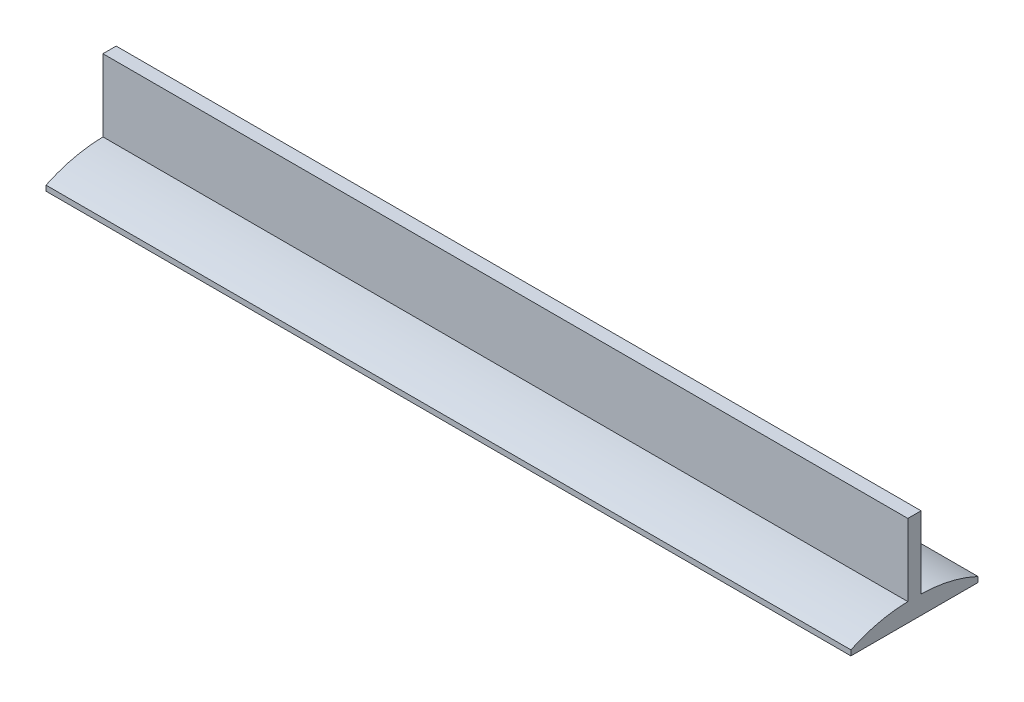
ISO-10303-21;
HEADER;
FILE_DESCRIPTION(('STEP AP214'),'2;1');
FILE_NAME('part.step','',(''),(''),'','','');
FILE_SCHEMA(('AUTOMOTIVE_DESIGN { 1 0 10303 214 1 1 1 1 }'));
ENDSEC;
DATA;
#1=APPLICATION_CONTEXT('core data for automotive mechanical design processes');
#2=APPLICATION_PROTOCOL_DEFINITION('international standard','automotive_design',2000,#1);
#3=PRODUCT_CONTEXT('',#1,'mechanical');
#4=PRODUCT('Part','Part','',(#3));
#5=PRODUCT_RELATED_PRODUCT_CATEGORY('part','',(#4));
#6=PRODUCT_DEFINITION_FORMATION('','',#4);
#7=PRODUCT_DEFINITION_CONTEXT('part definition',#1,'design');
#8=PRODUCT_DEFINITION('design','',#6,#7);
#9=PRODUCT_DEFINITION_SHAPE('','',#8);
#10=(LENGTH_UNIT() NAMED_UNIT(*) SI_UNIT(.MILLI.,.METRE.));
#11=(NAMED_UNIT(*) PLANE_ANGLE_UNIT() SI_UNIT($,.RADIAN.));
#12=(NAMED_UNIT(*) SI_UNIT($,.STERADIAN.) SOLID_ANGLE_UNIT());
#13=UNCERTAINTY_MEASURE_WITH_UNIT(LENGTH_MEASURE(1.E-05),#10,'distance_accuracy_value','');
#14=(GEOMETRIC_REPRESENTATION_CONTEXT(3) GLOBAL_UNCERTAINTY_ASSIGNED_CONTEXT((#13)) GLOBAL_UNIT_ASSIGNED_CONTEXT((#10,
#11,#12)) REPRESENTATION_CONTEXT('',''));
#15=CARTESIAN_POINT('',(0.,0.,0.));
#16=DIRECTION('',(0.,0.,1.));
#17=DIRECTION('',(1.,0.,0.));
#18=AXIS2_PLACEMENT_3D('',#15,#16,#17);
#19=CARTESIAN_POINT('',(-482.6,0.,0.));
#20=DIRECTION('',(0.,-1.,0.));
#21=DIRECTION('',(0.,0.,-1.));
#22=AXIS2_PLACEMENT_3D('',#19,#20,#21);
#23=PLANE('',#22);
#24=DIRECTION('',(0.,0.,-1.));
#25=VECTOR('',#24,1.);
#26=CARTESIAN_POINT('',(0.,0.,0.));
#27=LINE('',#26,#25);
#28=CARTESIAN_POINT('',(0.,0.,38.1));
#29=VERTEX_POINT('',#28);
#30=CARTESIAN_POINT('',(0.,0.,-38.1));
#31=VERTEX_POINT('',#30);
#32=EDGE_CURVE('E143',#29,#31,#27,.T.);
#33=ORIENTED_EDGE('',*,*,#32,.F.);
#34=DIRECTION('',(1.,0.,0.));
#35=VECTOR('',#34,1.);
#36=CARTESIAN_POINT('',(-482.6,0.,38.1));
#37=LINE('',#36,#35);
#38=CARTESIAN_POINT('',(-482.6,0.,38.1));
#39=VERTEX_POINT('',#38);
#40=EDGE_CURVE('E147',#39,#29,#37,.T.);
#41=ORIENTED_EDGE('',*,*,#40,.F.);
#42=DIRECTION('',(0.,0.,-1.));
#43=VECTOR('',#42,1.);
#44=CARTESIAN_POINT('',(-482.6,0.,0.));
#45=LINE('',#44,#43);
#46=CARTESIAN_POINT('',(-482.6,0.,-38.1));
#47=VERTEX_POINT('',#46);
#48=EDGE_CURVE('E134',#39,#47,#45,.T.);
#49=ORIENTED_EDGE('',*,*,#48,.T.);
#50=DIRECTION('',(1.,0.,0.));
#51=VECTOR('',#50,1.);
#52=CARTESIAN_POINT('',(-482.6,0.,-38.1));
#53=LINE('',#52,#51);
#54=EDGE_CURVE('E38',#47,#31,#53,.T.);
#55=ORIENTED_EDGE('',*,*,#54,.T.);
#56=EDGE_LOOP('',(#33,#41,#49,#55));
#57=FACE_BOUND('',#56,.T.);
#58=ADVANCED_FACE('F35',(#57),#23,.T.);
#59=CARTESIAN_POINT('',(-482.6,54.3464875628072,0.));
#60=DIRECTION('',(0.,1.,0.));
#61=DIRECTION('',(0.,0.,1.));
#62=AXIS2_PLACEMENT_3D('',#59,#60,#61);
#63=PLANE('',#62);
#64=DIRECTION('',(0.,0.,1.));
#65=VECTOR('',#64,1.);
#66=CARTESIAN_POINT('',(0.,54.3464875628072,0.));
#67=LINE('',#66,#65);
#68=CARTESIAN_POINT('',(0.,54.3464875628072,-3.96875000000001));
#69=VERTEX_POINT('',#68);
#70=CARTESIAN_POINT('',(0.,54.3464875628072,3.96875000000001));
#71=VERTEX_POINT('',#70);
#72=EDGE_CURVE('E138',#69,#71,#67,.T.);
#73=ORIENTED_EDGE('',*,*,#72,.F.);
#74=DIRECTION('',(1.,0.,0.));
#75=VECTOR('',#74,1.);
#76=CARTESIAN_POINT('',(-482.6,54.3464875628072,-3.96875000000001));
#77=LINE('',#76,#75);
#78=CARTESIAN_POINT('',(-482.6,54.3464875628072,-3.96875000000001));
#79=VERTEX_POINT('',#78);
#80=EDGE_CURVE('E11',#79,#69,#77,.T.);
#81=ORIENTED_EDGE('',*,*,#80,.F.);
#82=DIRECTION('',(0.,0.,1.));
#83=VECTOR('',#82,1.);
#84=CARTESIAN_POINT('',(-482.6,54.3464875628072,0.));
#85=LINE('',#84,#83);
#86=CARTESIAN_POINT('',(-482.6,54.3464875628072,3.96875000000001));
#87=VERTEX_POINT('',#86);
#88=EDGE_CURVE('E103',#79,#87,#85,.T.);
#89=ORIENTED_EDGE('',*,*,#88,.T.);
#90=DIRECTION('',(1.,0.,0.));
#91=VECTOR('',#90,1.);
#92=CARTESIAN_POINT('',(-482.6,54.3464875628072,3.96875000000001));
#93=LINE('',#92,#91);
#94=EDGE_CURVE('E107',#87,#71,#93,.T.);
#95=ORIENTED_EDGE('',*,*,#94,.T.);
#96=EDGE_LOOP('',(#73,#81,#89,#95));
#97=FACE_BOUND('',#96,.T.);
#98=ADVANCED_FACE('F105',(#97),#63,.T.);
#99=CARTESIAN_POINT('',(-482.6,54.3464875628072,-3.96875000000001));
#100=DIRECTION('',(0.,0.,-1.));
#101=DIRECTION('',(0.,1.,0.));
#102=AXIS2_PLACEMENT_3D('',#99,#100,#101);
#103=PLANE('',#102);
#104=DIRECTION('',(0.,1.,0.));
#105=VECTOR('',#104,1.);
#106=CARTESIAN_POINT('',(0.,54.3464875628072,-3.96875000000001));
#107=LINE('',#106,#105);
#108=CARTESIAN_POINT('',(0.,11.1514530705264,-3.96875000000001));
#109=VERTEX_POINT('',#108);
#110=EDGE_CURVE('E153',#109,#69,#107,.T.);
#111=ORIENTED_EDGE('',*,*,#110,.F.);
#112=DIRECTION('',(1.,0.,0.));
#113=VECTOR('',#112,1.);
#114=CARTESIAN_POINT('',(-482.6,11.1514530705264,-3.96875000000001));
#115=LINE('',#114,#113);
#116=CARTESIAN_POINT('',(-482.6,11.1514530705264,-3.96875000000001));
#117=VERTEX_POINT('',#116);
#118=EDGE_CURVE('E44',#117,#109,#115,.T.);
#119=ORIENTED_EDGE('',*,*,#118,.F.);
#120=DIRECTION('',(0.,1.,0.));
#121=VECTOR('',#120,1.);
#122=CARTESIAN_POINT('',(-482.6,54.3464875628072,-3.96875000000001));
#123=LINE('',#122,#121);
#124=EDGE_CURVE('E110',#117,#79,#123,.T.);
#125=ORIENTED_EDGE('',*,*,#124,.T.);
#126=ORIENTED_EDGE('',*,*,#80,.T.);
#127=EDGE_LOOP('',(#111,#119,#125,#126));
#128=FACE_BOUND('',#127,.T.);
#129=ADVANCED_FACE('F179',(#128),#103,.T.);
#130=CARTESIAN_POINT('',(-482.6,-72.6535124371928,-2.38125000000002));
#131=DIRECTION('',(1.,0.,0.));
#132=DIRECTION('',(0.,0.,-1.));
#133=AXIS2_PLACEMENT_3D('',#130,#131,#132);
#134=CYLINDRICAL_SURFACE('',#133,83.82);
#135=CARTESIAN_POINT('',(0.,-72.6535124371928,-2.38125000000002));
#136=DIRECTION('',(1.,0.,0.));
#137=DIRECTION('',(0.,0.,1.));
#138=AXIS2_PLACEMENT_3D('',#135,#136,#137);
#139=CIRCLE('',#138,83.82);
#140=CARTESIAN_POINT('',(0.,3.175,-38.1));
#141=VERTEX_POINT('',#140);
#142=EDGE_CURVE('E150',#141,#109,#139,.T.);
#143=ORIENTED_EDGE('',*,*,#142,.F.);
#144=DIRECTION('',(1.,0.,0.));
#145=VECTOR('',#144,1.);
#146=CARTESIAN_POINT('',(-482.6,3.175,-38.1));
#147=LINE('',#146,#145);
#148=CARTESIAN_POINT('',(-482.6,3.175,-38.1));
#149=VERTEX_POINT('',#148);
#150=EDGE_CURVE('E157',#149,#141,#147,.T.);
#151=ORIENTED_EDGE('',*,*,#150,.F.);
#152=CARTESIAN_POINT('',(-482.6,-72.6535124371928,-2.38125000000002));
#153=DIRECTION('',(1.,0.,0.));
#154=DIRECTION('',(0.,0.,1.));
#155=AXIS2_PLACEMENT_3D('',#152,#153,#154);
#156=CIRCLE('',#155,83.82);
#157=EDGE_CURVE('E140',#149,#117,#156,.T.);
#158=ORIENTED_EDGE('',*,*,#157,.T.);
#159=ORIENTED_EDGE('',*,*,#118,.T.);
#160=EDGE_LOOP('',(#143,#151,#158,#159));
#161=FACE_BOUND('',#160,.T.);
#162=ADVANCED_FACE('F181',(#161),#134,.T.);
#163=CARTESIAN_POINT('',(-482.6,0.,-38.1));
#164=DIRECTION('',(0.,0.,-1.));
#165=DIRECTION('',(-1.,0.,0.));
#166=AXIS2_PLACEMENT_3D('',#163,#164,#165);
#167=PLANE('',#166);
#168=DIRECTION('',(0.,1.,0.));
#169=VECTOR('',#168,1.);
#170=CARTESIAN_POINT('',(0.,0.,-38.1));
#171=LINE('',#170,#169);
#172=EDGE_CURVE('E146',#31,#141,#171,.T.);
#173=ORIENTED_EDGE('',*,*,#172,.F.);
#174=ORIENTED_EDGE('',*,*,#54,.F.);
#175=DIRECTION('',(0.,1.,0.));
#176=VECTOR('',#175,1.);
#177=CARTESIAN_POINT('',(-482.6,0.,-38.1));
#178=LINE('',#177,#176);
#179=EDGE_CURVE('E137',#47,#149,#178,.T.);
#180=ORIENTED_EDGE('',*,*,#179,.T.);
#181=ORIENTED_EDGE('',*,*,#150,.T.);
#182=EDGE_LOOP('',(#173,#174,#180,#181));
#183=FACE_BOUND('',#182,.T.);
#184=ADVANCED_FACE('F161',(#183),#167,.T.);
#185=CARTESIAN_POINT('',(-482.6,-72.6535124371928,-2.38125000000002));
#186=DIRECTION('',(-1.,0.,0.));
#187=DIRECTION('',(0.,0.,1.));
#188=AXIS2_PLACEMENT_3D('',#185,#186,#187);
#189=PLANE('',#188);
#190=ORIENTED_EDGE('',*,*,#48,.F.);
#191=DIRECTION('',(0.,1.,0.));
#192=VECTOR('',#191,1.);
#193=CARTESIAN_POINT('',(-482.6,0.,38.1));
#194=LINE('',#193,#192);
#195=CARTESIAN_POINT('',(-482.6,3.175,38.1));
#196=VERTEX_POINT('',#195);
#197=EDGE_CURVE('E127',#39,#196,#194,.T.);
#198=ORIENTED_EDGE('',*,*,#197,.T.);
#199=CARTESIAN_POINT('',(-482.6,-72.6535124371928,2.38125000000002));
#200=DIRECTION('',(-1.,0.,0.));
#201=DIRECTION('',(0.,0.,-1.));
#202=AXIS2_PLACEMENT_3D('',#199,#200,#201);
#203=CIRCLE('',#202,83.82);
#204=CARTESIAN_POINT('',(-482.6,11.1514530705264,3.96875000000001));
#205=VERTEX_POINT('',#204);
#206=EDGE_CURVE('E116',#196,#205,#203,.T.);
#207=ORIENTED_EDGE('',*,*,#206,.T.);
#208=DIRECTION('',(0.,1.,0.));
#209=VECTOR('',#208,1.);
#210=CARTESIAN_POINT('',(-482.6,54.3464875628072,3.96875000000001));
#211=LINE('',#210,#209);
#212=EDGE_CURVE('E113',#205,#87,#211,.T.);
#213=ORIENTED_EDGE('',*,*,#212,.T.);
#214=ORIENTED_EDGE('',*,*,#88,.F.);
#215=ORIENTED_EDGE('',*,*,#124,.F.);
#216=ORIENTED_EDGE('',*,*,#157,.F.);
#217=ORIENTED_EDGE('',*,*,#179,.F.);
#218=EDGE_LOOP('',(#190,#198,#207,#213,#214,#215,#216,#217));
#219=FACE_BOUND('',#218,.T.);
#220=ADVANCED_FACE('F114',(#219),#189,.T.);
#221=CARTESIAN_POINT('',(0.,-72.6535124371928,-2.38125000000002));
#222=DIRECTION('',(-1.,0.,0.));
#223=DIRECTION('',(0.,0.,1.));
#224=AXIS2_PLACEMENT_3D('',#221,#222,#223);
#225=PLANE('',#224);
#226=ORIENTED_EDGE('',*,*,#32,.T.);
#227=ORIENTED_EDGE('',*,*,#172,.T.);
#228=ORIENTED_EDGE('',*,*,#142,.T.);
#229=ORIENTED_EDGE('',*,*,#110,.T.);
#230=ORIENTED_EDGE('',*,*,#72,.T.);
#231=DIRECTION('',(0.,1.,0.));
#232=VECTOR('',#231,1.);
#233=CARTESIAN_POINT('',(0.,54.3464875628072,3.96875000000001));
#234=LINE('',#233,#232);
#235=CARTESIAN_POINT('',(0.,11.1514530705264,3.96875000000001));
#236=VERTEX_POINT('',#235);
#237=EDGE_CURVE('E125',#236,#71,#234,.T.);
#238=ORIENTED_EDGE('',*,*,#237,.F.);
#239=CARTESIAN_POINT('',(0.,-72.6535124371928,2.38125000000002));
#240=DIRECTION('',(-1.,0.,0.));
#241=DIRECTION('',(0.,0.,-1.));
#242=AXIS2_PLACEMENT_3D('',#239,#240,#241);
#243=CIRCLE('',#242,83.82);
#244=CARTESIAN_POINT('',(0.,3.175,38.1));
#245=VERTEX_POINT('',#244);
#246=EDGE_CURVE('E166',#245,#236,#243,.T.);
#247=ORIENTED_EDGE('',*,*,#246,.F.);
#248=DIRECTION('',(0.,1.,0.));
#249=VECTOR('',#248,1.);
#250=CARTESIAN_POINT('',(0.,0.,38.1));
#251=LINE('',#250,#249);
#252=EDGE_CURVE('E120',#29,#245,#251,.T.);
#253=ORIENTED_EDGE('',*,*,#252,.F.);
#254=EDGE_LOOP('',(#226,#227,#228,#229,#230,#238,#247,#253));
#255=FACE_BOUND('',#254,.T.);
#256=ADVANCED_FACE('F163',(#255),#225,.F.);
#257=CARTESIAN_POINT('',(-482.6,0.,38.1));
#258=DIRECTION('',(0.,0.,-1.));
#259=DIRECTION('',(-1.,0.,0.));
#260=AXIS2_PLACEMENT_3D('',#257,#258,#259);
#261=PLANE('',#260);
#262=ORIENTED_EDGE('',*,*,#252,.T.);
#263=DIRECTION('',(1.,0.,0.));
#264=VECTOR('',#263,1.);
#265=CARTESIAN_POINT('',(-482.6,3.175,38.1));
#266=LINE('',#265,#264);
#267=EDGE_CURVE('E129',#196,#245,#266,.T.);
#268=ORIENTED_EDGE('',*,*,#267,.F.);
#269=ORIENTED_EDGE('',*,*,#197,.F.);
#270=ORIENTED_EDGE('',*,*,#40,.T.);
#271=EDGE_LOOP('',(#262,#268,#269,#270));
#272=FACE_BOUND('',#271,.T.);
#273=ADVANCED_FACE('F172',(#272),#261,.F.);
#274=CARTESIAN_POINT('',(-482.6,-72.6535124371928,2.38125000000002));
#275=DIRECTION('',(1.,0.,0.));
#276=DIRECTION('',(0.,0.,-1.));
#277=AXIS2_PLACEMENT_3D('',#274,#275,#276);
#278=CYLINDRICAL_SURFACE('',#277,83.82);
#279=ORIENTED_EDGE('',*,*,#246,.T.);
#280=DIRECTION('',(1.,0.,0.));
#281=VECTOR('',#280,1.);
#282=CARTESIAN_POINT('',(-482.6,11.1514530705264,3.96875000000001));
#283=LINE('',#282,#281);
#284=EDGE_CURVE('E126',#205,#236,#283,.T.);
#285=ORIENTED_EDGE('',*,*,#284,.F.);
#286=ORIENTED_EDGE('',*,*,#206,.F.);
#287=ORIENTED_EDGE('',*,*,#267,.T.);
#288=EDGE_LOOP('',(#279,#285,#286,#287));
#289=FACE_BOUND('',#288,.T.);
#290=ADVANCED_FACE('F178',(#289),#278,.T.);
#291=CARTESIAN_POINT('',(-482.6,54.3464875628072,3.96875000000001));
#292=DIRECTION('',(0.,0.,-1.));
#293=DIRECTION('',(0.,1.,0.));
#294=AXIS2_PLACEMENT_3D('',#291,#292,#293);
#295=PLANE('',#294);
#296=ORIENTED_EDGE('',*,*,#237,.T.);
#297=ORIENTED_EDGE('',*,*,#94,.F.);
#298=ORIENTED_EDGE('',*,*,#212,.F.);
#299=ORIENTED_EDGE('',*,*,#284,.T.);
#300=EDGE_LOOP('',(#296,#297,#298,#299));
#301=FACE_BOUND('',#300,.T.);
#302=ADVANCED_FACE('F123',(#301),#295,.F.);
#303=CLOSED_SHELL('',(#58,#98,#129,#162,#184,#220,#256,#273,#290,#302));
#304=MANIFOLD_SOLID_BREP('B2',#303);
#305=ADVANCED_BREP_SHAPE_REPRESENTATION('',(#18,#304),#14);
#306=SHAPE_DEFINITION_REPRESENTATION(#9,#305);
ENDSEC;
END-ISO-10303-21;
